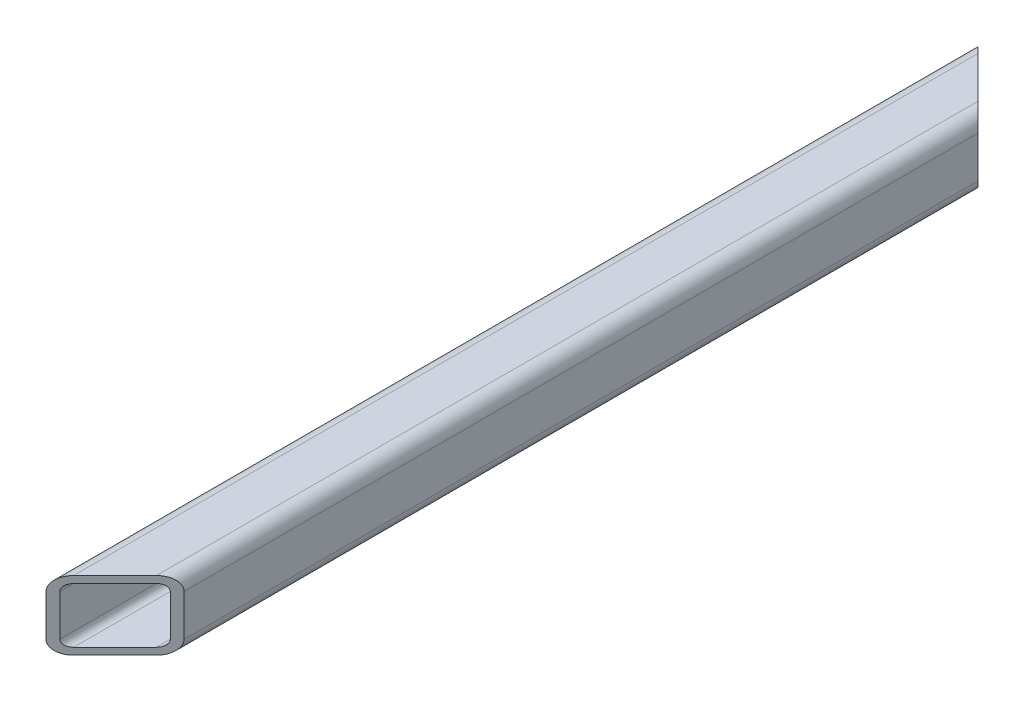
ISO-10303-21;
HEADER;
FILE_DESCRIPTION(('STEP AP214'),'2;1');
FILE_NAME('part.step','',(''),(''),'','','');
FILE_SCHEMA(('AUTOMOTIVE_DESIGN { 1 0 10303 214 1 1 1 1 }'));
ENDSEC;
DATA;
#1=APPLICATION_CONTEXT('core data for automotive mechanical design processes');
#2=APPLICATION_PROTOCOL_DEFINITION('international standard','automotive_design',2000,#1);
#3=PRODUCT_CONTEXT('',#1,'mechanical');
#4=PRODUCT('Part','Part','',(#3));
#5=PRODUCT_RELATED_PRODUCT_CATEGORY('part','',(#4));
#6=PRODUCT_DEFINITION_FORMATION('','',#4);
#7=PRODUCT_DEFINITION_CONTEXT('part definition',#1,'design');
#8=PRODUCT_DEFINITION('design','',#6,#7);
#9=PRODUCT_DEFINITION_SHAPE('','',#8);
#10=(LENGTH_UNIT() NAMED_UNIT(*) SI_UNIT(.MILLI.,.METRE.));
#11=(NAMED_UNIT(*) PLANE_ANGLE_UNIT() SI_UNIT($,.RADIAN.));
#12=(NAMED_UNIT(*) SI_UNIT($,.STERADIAN.) SOLID_ANGLE_UNIT());
#13=UNCERTAINTY_MEASURE_WITH_UNIT(LENGTH_MEASURE(1.E-05),#10,'distance_accuracy_value','');
#14=(GEOMETRIC_REPRESENTATION_CONTEXT(3) GLOBAL_UNCERTAINTY_ASSIGNED_CONTEXT((#13)) GLOBAL_UNIT_ASSIGNED_CONTEXT((#10,
#11,#12)) REPRESENTATION_CONTEXT('',''));
#15=CARTESIAN_POINT('',(0.,0.,0.));
#16=DIRECTION('',(0.,0.,1.));
#17=DIRECTION('',(1.,0.,0.));
#18=AXIS2_PLACEMENT_3D('',#15,#16,#17);
#19=CARTESIAN_POINT('',(-231.,206.,-450.));
#20=DIRECTION('',(0.,0.,1.));
#21=DIRECTION('',(1.,0.,0.));
#22=AXIS2_PLACEMENT_3D('',#19,#20,#21);
#23=CYLINDRICAL_SURFACE('',#22,4.);
#24=CARTESIAN_POINT('',(-231.,206.,-456.));
#25=DIRECTION('',(0.707106781186548,0.,-0.707106781186548));
#26=DIRECTION('',(0.707106781186548,0.,0.707106781186548));
#27=AXIS2_PLACEMENT_3D('',#24,#25,#26);
#28=ELLIPSE('',#27,5.65685424949238,4.);
#29=CARTESIAN_POINT('',(-235.,206.,-460.));
#30=VERTEX_POINT('',#29);
#31=CARTESIAN_POINT('',(-231.,210.,-456.));
#32=VERTEX_POINT('',#31);
#33=EDGE_CURVE('E169',#30,#32,#28,.T.);
#34=ORIENTED_EDGE('',*,*,#33,.F.);
#35=DIRECTION('',(0.,0.,1.));
#36=VECTOR('',#35,1.);
#37=CARTESIAN_POINT('',(-235.,206.,-450.));
#38=LINE('',#37,#36);
#39=CARTESIAN_POINT('',(-235.,206.,-190.));
#40=VERTEX_POINT('',#39);
#41=EDGE_CURVE('E45',#30,#40,#38,.T.);
#42=ORIENTED_EDGE('',*,*,#41,.T.);
#43=CARTESIAN_POINT('',(-231.,206.,-194.));
#44=DIRECTION('',(0.707106781186548,0.,0.707106781186548));
#45=DIRECTION('',(-0.707106781186548,0.,0.707106781186548));
#46=AXIS2_PLACEMENT_3D('',#43,#44,#45);
#47=ELLIPSE('',#46,5.65685424949239,4.);
#48=CARTESIAN_POINT('',(-231.,210.,-194.));
#49=VERTEX_POINT('',#48);
#50=EDGE_CURVE('E250',#49,#40,#47,.T.);
#51=ORIENTED_EDGE('',*,*,#50,.F.);
#52=DIRECTION('',(0.,0.,1.));
#53=VECTOR('',#52,1.);
#54=CARTESIAN_POINT('',(-231.,210.,-450.));
#55=LINE('',#54,#53);
#56=EDGE_CURVE('E243',#32,#49,#55,.T.);
#57=ORIENTED_EDGE('',*,*,#56,.F.);
#58=EDGE_LOOP('',(#34,#42,#51,#57));
#59=FACE_BOUND('',#58,.T.);
#60=ADVANCED_FACE('F41',(#59),#23,.T.);
#61=CARTESIAN_POINT('',(-231.,210.,-450.));
#62=DIRECTION('',(0.,-1.,0.));
#63=DIRECTION('',(0.,0.,-1.));
#64=AXIS2_PLACEMENT_3D('',#61,#62,#63);
#65=PLANE('',#64);
#66=DIRECTION('',(0.707106781186548,0.,0.707106781186548));
#67=VECTOR('',#66,1.);
#68=CARTESIAN_POINT('',(-228.,210.,-453.));
#69=LINE('',#68,#67);
#70=CARTESIAN_POINT('',(-219.,210.,-444.));
#71=VERTEX_POINT('',#70);
#72=EDGE_CURVE('E187',#32,#71,#69,.T.);
#73=ORIENTED_EDGE('',*,*,#72,.F.);
#74=ORIENTED_EDGE('',*,*,#56,.T.);
#75=DIRECTION('',(-0.707106781186548,0.,0.707106781186548));
#76=VECTOR('',#75,1.);
#77=CARTESIAN_POINT('',(-103.,210.,-322.));
#78=LINE('',#77,#76);
#79=CARTESIAN_POINT('',(-219.,210.,-206.));
#80=VERTEX_POINT('',#79);
#81=EDGE_CURVE('E159',#80,#49,#78,.T.);
#82=ORIENTED_EDGE('',*,*,#81,.F.);
#83=DIRECTION('',(0.,0.,1.));
#84=VECTOR('',#83,1.);
#85=CARTESIAN_POINT('',(-219.,210.,-450.));
#86=LINE('',#85,#84);
#87=EDGE_CURVE('E242',#71,#80,#86,.T.);
#88=ORIENTED_EDGE('',*,*,#87,.F.);
#89=EDGE_LOOP('',(#73,#74,#82,#88));
#90=FACE_BOUND('',#89,.T.);
#91=ADVANCED_FACE('F297',(#90),#65,.F.);
#92=CARTESIAN_POINT('',(-219.,206.,-450.));
#93=DIRECTION('',(0.,0.,1.));
#94=DIRECTION('',(1.,0.,0.));
#95=AXIS2_PLACEMENT_3D('',#92,#93,#94);
#96=CYLINDRICAL_SURFACE('',#95,4.);
#97=CARTESIAN_POINT('',(-219.,206.,-444.));
#98=DIRECTION('',(0.707106781186548,0.,-0.707106781186548));
#99=DIRECTION('',(0.707106781186548,0.,0.707106781186548));
#100=AXIS2_PLACEMENT_3D('',#97,#98,#99);
#101=ELLIPSE('',#100,5.65685424949238,4.);
#102=CARTESIAN_POINT('',(-215.,206.,-440.));
#103=VERTEX_POINT('',#102);
#104=EDGE_CURVE('E184',#71,#103,#101,.T.);
#105=ORIENTED_EDGE('',*,*,#104,.F.);
#106=ORIENTED_EDGE('',*,*,#87,.T.);
#107=CARTESIAN_POINT('',(-219.,206.,-206.));
#108=DIRECTION('',(0.707106781186548,0.,0.707106781186548));
#109=DIRECTION('',(-0.707106781186548,0.,0.707106781186548));
#110=AXIS2_PLACEMENT_3D('',#107,#108,#109);
#111=ELLIPSE('',#110,5.65685424949239,4.);
#112=CARTESIAN_POINT('',(-215.,206.,-210.));
#113=VERTEX_POINT('',#112);
#114=EDGE_CURVE('E170',#113,#80,#111,.T.);
#115=ORIENTED_EDGE('',*,*,#114,.F.);
#116=DIRECTION('',(0.,0.,1.));
#117=VECTOR('',#116,1.);
#118=CARTESIAN_POINT('',(-215.,206.,-450.));
#119=LINE('',#118,#117);
#120=EDGE_CURVE('E240',#103,#113,#119,.T.);
#121=ORIENTED_EDGE('',*,*,#120,.F.);
#122=EDGE_LOOP('',(#105,#106,#115,#121));
#123=FACE_BOUND('',#122,.T.);
#124=ADVANCED_FACE('F295',(#123),#96,.T.);
#125=CARTESIAN_POINT('',(-215.,194.,-450.));
#126=DIRECTION('',(-1.,0.,0.));
#127=DIRECTION('',(0.,0.,1.));
#128=AXIS2_PLACEMENT_3D('',#125,#126,#127);
#129=PLANE('',#128);
#130=DIRECTION('',(0.,-1.,0.));
#131=VECTOR('',#130,1.);
#132=CARTESIAN_POINT('',(-215.,194.,-440.));
#133=LINE('',#132,#131);
#134=CARTESIAN_POINT('',(-215.,194.,-440.));
#135=VERTEX_POINT('',#134);
#136=EDGE_CURVE('E179',#103,#135,#133,.T.);
#137=ORIENTED_EDGE('',*,*,#136,.F.);
#138=ORIENTED_EDGE('',*,*,#120,.T.);
#139=DIRECTION('',(0.,1.,0.));
#140=VECTOR('',#139,1.);
#141=CARTESIAN_POINT('',(-215.,194.,-210.));
#142=LINE('',#141,#140);
#143=CARTESIAN_POINT('',(-215.,194.,-210.));
#144=VERTEX_POINT('',#143);
#145=EDGE_CURVE('E289',#144,#113,#142,.T.);
#146=ORIENTED_EDGE('',*,*,#145,.F.);
#147=DIRECTION('',(0.,0.,1.));
#148=VECTOR('',#147,1.);
#149=CARTESIAN_POINT('',(-215.,194.,-450.));
#150=LINE('',#149,#148);
#151=EDGE_CURVE('E238',#135,#144,#150,.T.);
#152=ORIENTED_EDGE('',*,*,#151,.F.);
#153=EDGE_LOOP('',(#137,#138,#146,#152));
#154=FACE_BOUND('',#153,.T.);
#155=ADVANCED_FACE('F304',(#154),#129,.F.);
#156=CARTESIAN_POINT('',(-219.,194.,-450.));
#157=DIRECTION('',(0.,0.,1.));
#158=DIRECTION('',(1.,0.,0.));
#159=AXIS2_PLACEMENT_3D('',#156,#157,#158);
#160=CYLINDRICAL_SURFACE('',#159,4.);
#161=CARTESIAN_POINT('',(-219.,194.,-444.));
#162=DIRECTION('',(0.707106781186548,0.,-0.707106781186548));
#163=DIRECTION('',(0.707106781186548,0.,0.707106781186548));
#164=AXIS2_PLACEMENT_3D('',#161,#162,#163);
#165=ELLIPSE('',#164,5.65685424949238,4.);
#166=CARTESIAN_POINT('',(-219.,190.,-444.));
#167=VERTEX_POINT('',#166);
#168=EDGE_CURVE('E175',#135,#167,#165,.T.);
#169=ORIENTED_EDGE('',*,*,#168,.F.);
#170=ORIENTED_EDGE('',*,*,#151,.T.);
#171=CARTESIAN_POINT('',(-219.,194.,-206.));
#172=DIRECTION('',(0.707106781186548,0.,0.707106781186548));
#173=DIRECTION('',(-0.707106781186548,0.,0.707106781186548));
#174=AXIS2_PLACEMENT_3D('',#171,#172,#173);
#175=ELLIPSE('',#174,5.65685424949239,4.);
#176=CARTESIAN_POINT('',(-219.,190.,-206.));
#177=VERTEX_POINT('',#176);
#178=EDGE_CURVE('E286',#177,#144,#175,.T.);
#179=ORIENTED_EDGE('',*,*,#178,.F.);
#180=DIRECTION('',(0.,0.,1.));
#181=VECTOR('',#180,1.);
#182=CARTESIAN_POINT('',(-219.,190.,-450.));
#183=LINE('',#182,#181);
#184=EDGE_CURVE('E236',#167,#177,#183,.T.);
#185=ORIENTED_EDGE('',*,*,#184,.F.);
#186=EDGE_LOOP('',(#169,#170,#179,#185));
#187=FACE_BOUND('',#186,.T.);
#188=ADVANCED_FACE('F309',(#187),#160,.T.);
#189=CARTESIAN_POINT('',(-219.,190.,-450.));
#190=DIRECTION('',(0.,1.,0.));
#191=DIRECTION('',(0.,0.,1.));
#192=AXIS2_PLACEMENT_3D('',#189,#190,#191);
#193=PLANE('',#192);
#194=DIRECTION('',(-0.707106781186548,0.,-0.707106781186548));
#195=VECTOR('',#194,1.);
#196=CARTESIAN_POINT('',(-222.,190.,-447.));
#197=LINE('',#196,#195);
#198=CARTESIAN_POINT('',(-231.,190.,-456.));
#199=VERTEX_POINT('',#198);
#200=EDGE_CURVE('E51',#167,#199,#197,.T.);
#201=ORIENTED_EDGE('',*,*,#200,.F.);
#202=ORIENTED_EDGE('',*,*,#184,.T.);
#203=DIRECTION('',(0.707106781186548,0.,-0.707106781186548));
#204=VECTOR('',#203,1.);
#205=CARTESIAN_POINT('',(-96.9999999999999,190.,-328.));
#206=LINE('',#205,#204);
#207=CARTESIAN_POINT('',(-231.,190.,-194.));
#208=VERTEX_POINT('',#207);
#209=EDGE_CURVE('E283',#208,#177,#206,.T.);
#210=ORIENTED_EDGE('',*,*,#209,.F.);
#211=DIRECTION('',(0.,0.,1.));
#212=VECTOR('',#211,1.);
#213=CARTESIAN_POINT('',(-231.,190.,-450.));
#214=LINE('',#213,#212);
#215=EDGE_CURVE('E194',#199,#208,#214,.T.);
#216=ORIENTED_EDGE('',*,*,#215,.F.);
#217=EDGE_LOOP('',(#201,#202,#210,#216));
#218=FACE_BOUND('',#217,.T.);
#219=ADVANCED_FACE('F313',(#218),#193,.F.);
#220=CARTESIAN_POINT('',(-231.,194.,-450.));
#221=DIRECTION('',(0.,0.,1.));
#222=DIRECTION('',(1.,0.,0.));
#223=AXIS2_PLACEMENT_3D('',#220,#221,#222);
#224=CYLINDRICAL_SURFACE('',#223,4.);
#225=CARTESIAN_POINT('',(-231.,194.,-456.));
#226=DIRECTION('',(0.707106781186548,0.,-0.707106781186548));
#227=DIRECTION('',(0.707106781186548,0.,0.707106781186548));
#228=AXIS2_PLACEMENT_3D('',#225,#226,#227);
#229=ELLIPSE('',#228,5.65685424949238,4.);
#230=CARTESIAN_POINT('',(-235.,194.,-460.));
#231=VERTEX_POINT('',#230);
#232=EDGE_CURVE('E11',#199,#231,#229,.T.);
#233=ORIENTED_EDGE('',*,*,#232,.F.);
#234=ORIENTED_EDGE('',*,*,#215,.T.);
#235=CARTESIAN_POINT('',(-231.,194.,-194.));
#236=DIRECTION('',(0.707106781186548,0.,0.707106781186548));
#237=DIRECTION('',(-0.707106781186548,0.,0.707106781186548));
#238=AXIS2_PLACEMENT_3D('',#235,#236,#237);
#239=ELLIPSE('',#238,5.65685424949239,4.);
#240=CARTESIAN_POINT('',(-235.,194.,-190.));
#241=VERTEX_POINT('',#240);
#242=EDGE_CURVE('E155',#241,#208,#239,.T.);
#243=ORIENTED_EDGE('',*,*,#242,.F.);
#244=DIRECTION('',(0.,0.,1.));
#245=VECTOR('',#244,1.);
#246=CARTESIAN_POINT('',(-235.,194.,-450.));
#247=LINE('',#246,#245);
#248=EDGE_CURVE('E150',#231,#241,#247,.T.);
#249=ORIENTED_EDGE('',*,*,#248,.F.);
#250=EDGE_LOOP('',(#233,#234,#243,#249));
#251=FACE_BOUND('',#250,.T.);
#252=ADVANCED_FACE('F152',(#251),#224,.T.);
#253=CARTESIAN_POINT('',(-219.,206.,-450.));
#254=DIRECTION('',(0.,0.,1.));
#255=DIRECTION('',(1.,0.,0.));
#256=AXIS2_PLACEMENT_3D('',#253,#254,#255);
#257=CYLINDRICAL_SURFACE('',#256,2.);
#258=DIRECTION('',(0.,0.,1.));
#259=VECTOR('',#258,1.);
#260=CARTESIAN_POINT('',(-219.,208.,-450.));
#261=LINE('',#260,#259);
#262=CARTESIAN_POINT('',(-219.,208.,-444.));
#263=VERTEX_POINT('',#262);
#264=CARTESIAN_POINT('',(-219.,208.,-206.));
#265=VERTEX_POINT('',#264);
#266=EDGE_CURVE('E198',#263,#265,#261,.T.);
#267=ORIENTED_EDGE('',*,*,#266,.F.);
#268=CARTESIAN_POINT('',(-219.,206.,-444.));
#269=DIRECTION('',(0.707106781186548,0.,-0.707106781186548));
#270=DIRECTION('',(0.707106781186548,0.,0.707106781186548));
#271=AXIS2_PLACEMENT_3D('',#268,#269,#270);
#272=ELLIPSE('',#271,2.82842712474619,2.);
#273=CARTESIAN_POINT('',(-217.,206.,-442.));
#274=VERTEX_POINT('',#273);
#275=EDGE_CURVE('E191',#263,#274,#272,.T.);
#276=ORIENTED_EDGE('',*,*,#275,.T.);
#277=DIRECTION('',(0.,0.,1.));
#278=VECTOR('',#277,1.);
#279=CARTESIAN_POINT('',(-217.,206.,-450.));
#280=LINE('',#279,#278);
#281=CARTESIAN_POINT('',(-217.,206.,-208.));
#282=VERTEX_POINT('',#281);
#283=EDGE_CURVE('E193',#274,#282,#280,.T.);
#284=ORIENTED_EDGE('',*,*,#283,.T.);
#285=CARTESIAN_POINT('',(-219.,206.,-206.));
#286=DIRECTION('',(0.707106781186548,0.,0.707106781186548));
#287=DIRECTION('',(-0.707106781186548,0.,0.707106781186548));
#288=AXIS2_PLACEMENT_3D('',#285,#286,#287);
#289=ELLIPSE('',#288,2.82842712474619,2.);
#290=EDGE_CURVE('E199',#282,#265,#289,.T.);
#291=ORIENTED_EDGE('',*,*,#290,.T.);
#292=EDGE_LOOP('',(#267,#276,#284,#291));
#293=FACE_BOUND('',#292,.T.);
#294=ADVANCED_FACE('F319',(#293),#257,.F.);
#295=CARTESIAN_POINT('',(-231.,208.,-450.));
#296=DIRECTION('',(0.,-1.,0.));
#297=DIRECTION('',(0.,0.,-1.));
#298=AXIS2_PLACEMENT_3D('',#295,#296,#297);
#299=PLANE('',#298);
#300=DIRECTION('',(0.,0.,1.));
#301=VECTOR('',#300,1.);
#302=CARTESIAN_POINT('',(-231.,208.,-450.));
#303=LINE('',#302,#301);
#304=CARTESIAN_POINT('',(-231.,208.,-456.));
#305=VERTEX_POINT('',#304);
#306=CARTESIAN_POINT('',(-231.,208.,-194.));
#307=VERTEX_POINT('',#306);
#308=EDGE_CURVE('E203',#305,#307,#303,.T.);
#309=ORIENTED_EDGE('',*,*,#308,.F.);
#310=DIRECTION('',(0.707106781186548,0.,0.707106781186548));
#311=VECTOR('',#310,1.);
#312=CARTESIAN_POINT('',(-228.,208.,-453.));
#313=LINE('',#312,#311);
#314=EDGE_CURVE('E195',#305,#263,#313,.T.);
#315=ORIENTED_EDGE('',*,*,#314,.T.);
#316=ORIENTED_EDGE('',*,*,#266,.T.);
#317=DIRECTION('',(-0.707106781186548,0.,0.707106781186548));
#318=VECTOR('',#317,1.);
#319=CARTESIAN_POINT('',(-103.,208.,-322.));
#320=LINE('',#319,#318);
#321=EDGE_CURVE('E204',#265,#307,#320,.T.);
#322=ORIENTED_EDGE('',*,*,#321,.T.);
#323=EDGE_LOOP('',(#309,#315,#316,#322));
#324=FACE_BOUND('',#323,.T.);
#325=ADVANCED_FACE('F325',(#324),#299,.T.);
#326=CARTESIAN_POINT('',(-231.,206.,-450.));
#327=DIRECTION('',(0.,0.,1.));
#328=DIRECTION('',(1.,0.,0.));
#329=AXIS2_PLACEMENT_3D('',#326,#327,#328);
#330=CYLINDRICAL_SURFACE('',#329,2.);
#331=DIRECTION('',(0.,0.,1.));
#332=VECTOR('',#331,1.);
#333=CARTESIAN_POINT('',(-233.,206.,-450.));
#334=LINE('',#333,#332);
#335=CARTESIAN_POINT('',(-233.,206.,-458.));
#336=VERTEX_POINT('',#335);
#337=CARTESIAN_POINT('',(-233.,206.,-192.));
#338=VERTEX_POINT('',#337);
#339=EDGE_CURVE('E208',#336,#338,#334,.T.);
#340=ORIENTED_EDGE('',*,*,#339,.F.);
#341=CARTESIAN_POINT('',(-231.,206.,-456.));
#342=DIRECTION('',(0.707106781186548,0.,-0.707106781186548));
#343=DIRECTION('',(0.707106781186548,0.,0.707106781186548));
#344=AXIS2_PLACEMENT_3D('',#341,#342,#343);
#345=ELLIPSE('',#344,2.82842712474619,2.);
#346=EDGE_CURVE('E200',#336,#305,#345,.T.);
#347=ORIENTED_EDGE('',*,*,#346,.T.);
#348=ORIENTED_EDGE('',*,*,#308,.T.);
#349=CARTESIAN_POINT('',(-231.,206.,-194.));
#350=DIRECTION('',(0.707106781186548,0.,0.707106781186548));
#351=DIRECTION('',(-0.707106781186548,0.,0.707106781186548));
#352=AXIS2_PLACEMENT_3D('',#349,#350,#351);
#353=ELLIPSE('',#352,2.82842712474619,2.);
#354=EDGE_CURVE('E209',#307,#338,#353,.T.);
#355=ORIENTED_EDGE('',*,*,#354,.T.);
#356=EDGE_LOOP('',(#340,#347,#348,#355));
#357=FACE_BOUND('',#356,.T.);
#358=ADVANCED_FACE('F329',(#357),#330,.F.);
#359=CARTESIAN_POINT('',(-233.,206.,-450.));
#360=DIRECTION('',(1.,0.,0.));
#361=DIRECTION('',(0.,0.,-1.));
#362=AXIS2_PLACEMENT_3D('',#359,#360,#361);
#363=PLANE('',#362);
#364=DIRECTION('',(0.,0.,1.));
#365=VECTOR('',#364,1.);
#366=CARTESIAN_POINT('',(-233.,194.,-450.));
#367=LINE('',#366,#365);
#368=CARTESIAN_POINT('',(-233.,194.,-458.));
#369=VERTEX_POINT('',#368);
#370=CARTESIAN_POINT('',(-233.,194.,-192.));
#371=VERTEX_POINT('',#370);
#372=EDGE_CURVE('E213',#369,#371,#367,.T.);
#373=ORIENTED_EDGE('',*,*,#372,.F.);
#374=DIRECTION('',(0.,1.,0.));
#375=VECTOR('',#374,1.);
#376=CARTESIAN_POINT('',(-233.,206.,-458.));
#377=LINE('',#376,#375);
#378=EDGE_CURVE('E205',#369,#336,#377,.T.);
#379=ORIENTED_EDGE('',*,*,#378,.T.);
#380=ORIENTED_EDGE('',*,*,#339,.T.);
#381=DIRECTION('',(0.,-1.,0.));
#382=VECTOR('',#381,1.);
#383=CARTESIAN_POINT('',(-233.,206.,-192.));
#384=LINE('',#383,#382);
#385=EDGE_CURVE('E214',#338,#371,#384,.T.);
#386=ORIENTED_EDGE('',*,*,#385,.T.);
#387=EDGE_LOOP('',(#373,#379,#380,#386));
#388=FACE_BOUND('',#387,.T.);
#389=ADVANCED_FACE('F333',(#388),#363,.T.);
#390=CARTESIAN_POINT('',(-231.,194.,-450.));
#391=DIRECTION('',(0.,0.,1.));
#392=DIRECTION('',(1.,0.,0.));
#393=AXIS2_PLACEMENT_3D('',#390,#391,#392);
#394=CYLINDRICAL_SURFACE('',#393,2.);
#395=DIRECTION('',(0.,0.,1.));
#396=VECTOR('',#395,1.);
#397=CARTESIAN_POINT('',(-231.,192.,-450.));
#398=LINE('',#397,#396);
#399=CARTESIAN_POINT('',(-231.,192.,-456.));
#400=VERTEX_POINT('',#399);
#401=CARTESIAN_POINT('',(-231.,192.,-194.));
#402=VERTEX_POINT('',#401);
#403=EDGE_CURVE('E218',#400,#402,#398,.T.);
#404=ORIENTED_EDGE('',*,*,#403,.F.);
#405=CARTESIAN_POINT('',(-231.,194.,-456.));
#406=DIRECTION('',(0.707106781186548,0.,-0.707106781186548));
#407=DIRECTION('',(0.707106781186548,0.,0.707106781186548));
#408=AXIS2_PLACEMENT_3D('',#405,#406,#407);
#409=ELLIPSE('',#408,2.82842712474619,2.);
#410=EDGE_CURVE('E210',#400,#369,#409,.T.);
#411=ORIENTED_EDGE('',*,*,#410,.T.);
#412=ORIENTED_EDGE('',*,*,#372,.T.);
#413=CARTESIAN_POINT('',(-231.,194.,-194.));
#414=DIRECTION('',(0.707106781186548,0.,0.707106781186548));
#415=DIRECTION('',(-0.707106781186548,0.,0.707106781186548));
#416=AXIS2_PLACEMENT_3D('',#413,#414,#415);
#417=ELLIPSE('',#416,2.82842712474619,2.);
#418=EDGE_CURVE('E219',#371,#402,#417,.T.);
#419=ORIENTED_EDGE('',*,*,#418,.T.);
#420=EDGE_LOOP('',(#404,#411,#412,#419));
#421=FACE_BOUND('',#420,.T.);
#422=ADVANCED_FACE('F337',(#421),#394,.F.);
#423=CARTESIAN_POINT('',(-219.,192.,-450.));
#424=DIRECTION('',(0.,1.,0.));
#425=DIRECTION('',(0.,0.,1.));
#426=AXIS2_PLACEMENT_3D('',#423,#424,#425);
#427=PLANE('',#426);
#428=DIRECTION('',(0.,0.,1.));
#429=VECTOR('',#428,1.);
#430=CARTESIAN_POINT('',(-219.,192.,-450.));
#431=LINE('',#430,#429);
#432=CARTESIAN_POINT('',(-219.,192.,-444.));
#433=VERTEX_POINT('',#432);
#434=CARTESIAN_POINT('',(-219.,192.,-206.));
#435=VERTEX_POINT('',#434);
#436=EDGE_CURVE('E222',#433,#435,#431,.T.);
#437=ORIENTED_EDGE('',*,*,#436,.F.);
#438=DIRECTION('',(-0.707106781186548,0.,-0.707106781186548));
#439=VECTOR('',#438,1.);
#440=CARTESIAN_POINT('',(-222.,192.,-447.));
#441=LINE('',#440,#439);
#442=EDGE_CURVE('E215',#433,#400,#441,.T.);
#443=ORIENTED_EDGE('',*,*,#442,.T.);
#444=ORIENTED_EDGE('',*,*,#403,.T.);
#445=DIRECTION('',(0.707106781186548,0.,-0.707106781186548));
#446=VECTOR('',#445,1.);
#447=CARTESIAN_POINT('',(-96.9999999999999,192.,-328.));
#448=LINE('',#447,#446);
#449=EDGE_CURVE('E223',#402,#435,#448,.T.);
#450=ORIENTED_EDGE('',*,*,#449,.T.);
#451=EDGE_LOOP('',(#437,#443,#444,#450));
#452=FACE_BOUND('',#451,.T.);
#453=ADVANCED_FACE('F341',(#452),#427,.T.);
#454=CARTESIAN_POINT('',(-219.,194.,-450.));
#455=DIRECTION('',(0.,0.,1.));
#456=DIRECTION('',(1.,0.,0.));
#457=AXIS2_PLACEMENT_3D('',#454,#455,#456);
#458=CYLINDRICAL_SURFACE('',#457,2.);
#459=DIRECTION('',(0.,0.,1.));
#460=VECTOR('',#459,1.);
#461=CARTESIAN_POINT('',(-217.,194.,-450.));
#462=LINE('',#461,#460);
#463=CARTESIAN_POINT('',(-217.,194.,-442.));
#464=VERTEX_POINT('',#463);
#465=CARTESIAN_POINT('',(-217.,194.,-208.));
#466=VERTEX_POINT('',#465);
#467=EDGE_CURVE('E225',#464,#466,#462,.T.);
#468=ORIENTED_EDGE('',*,*,#467,.F.);
#469=CARTESIAN_POINT('',(-219.,194.,-444.));
#470=DIRECTION('',(0.707106781186548,0.,-0.707106781186548));
#471=DIRECTION('',(0.707106781186548,0.,0.707106781186548));
#472=AXIS2_PLACEMENT_3D('',#469,#470,#471);
#473=ELLIPSE('',#472,2.82842712474619,2.);
#474=EDGE_CURVE('E220',#464,#433,#473,.T.);
#475=ORIENTED_EDGE('',*,*,#474,.T.);
#476=ORIENTED_EDGE('',*,*,#436,.T.);
#477=CARTESIAN_POINT('',(-219.,194.,-206.));
#478=DIRECTION('',(0.707106781186548,0.,0.707106781186548));
#479=DIRECTION('',(-0.707106781186548,0.,0.707106781186548));
#480=AXIS2_PLACEMENT_3D('',#477,#478,#479);
#481=ELLIPSE('',#480,2.82842712474619,2.);
#482=EDGE_CURVE('E228',#435,#466,#481,.T.);
#483=ORIENTED_EDGE('',*,*,#482,.T.);
#484=EDGE_LOOP('',(#468,#475,#476,#483));
#485=FACE_BOUND('',#484,.T.);
#486=ADVANCED_FACE('F345',(#485),#458,.F.);
#487=CARTESIAN_POINT('',(-217.,194.,-450.));
#488=DIRECTION('',(-1.,0.,0.));
#489=DIRECTION('',(0.,0.,1.));
#490=AXIS2_PLACEMENT_3D('',#487,#488,#489);
#491=PLANE('',#490);
#492=ORIENTED_EDGE('',*,*,#283,.F.);
#493=DIRECTION('',(0.,-1.,0.));
#494=VECTOR('',#493,1.);
#495=CARTESIAN_POINT('',(-217.,194.,-442.));
#496=LINE('',#495,#494);
#497=EDGE_CURVE('E59',#274,#464,#496,.T.);
#498=ORIENTED_EDGE('',*,*,#497,.T.);
#499=ORIENTED_EDGE('',*,*,#467,.T.);
#500=DIRECTION('',(0.,1.,0.));
#501=VECTOR('',#500,1.);
#502=CARTESIAN_POINT('',(-217.,194.,-208.));
#503=LINE('',#502,#501);
#504=EDGE_CURVE('E160',#466,#282,#503,.T.);
#505=ORIENTED_EDGE('',*,*,#504,.T.);
#506=EDGE_LOOP('',(#492,#498,#499,#505));
#507=FACE_BOUND('',#506,.T.);
#508=ADVANCED_FACE('F322',(#507),#491,.T.);
#509=CARTESIAN_POINT('',(-235.,206.,-450.));
#510=DIRECTION('',(1.,0.,0.));
#511=DIRECTION('',(0.,0.,-1.));
#512=AXIS2_PLACEMENT_3D('',#509,#510,#511);
#513=PLANE('',#512);
#514=DIRECTION('',(0.,1.,0.));
#515=VECTOR('',#514,1.);
#516=CARTESIAN_POINT('',(-235.,206.,-460.));
#517=LINE('',#516,#515);
#518=EDGE_CURVE('E164',#231,#30,#517,.T.);
#519=ORIENTED_EDGE('',*,*,#518,.F.);
#520=ORIENTED_EDGE('',*,*,#248,.T.);
#521=DIRECTION('',(0.,-1.,0.));
#522=VECTOR('',#521,1.);
#523=CARTESIAN_POINT('',(-235.,206.,-190.));
#524=LINE('',#523,#522);
#525=EDGE_CURVE('E252',#40,#241,#524,.T.);
#526=ORIENTED_EDGE('',*,*,#525,.F.);
#527=ORIENTED_EDGE('',*,*,#41,.F.);
#528=EDGE_LOOP('',(#519,#520,#526,#527));
#529=FACE_BOUND('',#528,.T.);
#530=ADVANCED_FACE('F165',(#529),#513,.F.);
#531=CARTESIAN_POINT('',(-225.,200.,-200.));
#532=DIRECTION('',(0.707106781186548,0.,0.707106781186548));
#533=DIRECTION('',(0.707106781186548,0.,-0.707106781186548));
#534=AXIS2_PLACEMENT_3D('',#531,#532,#533);
#535=PLANE('',#534);
#536=ORIENTED_EDGE('',*,*,#290,.F.);
#537=ORIENTED_EDGE('',*,*,#504,.F.);
#538=ORIENTED_EDGE('',*,*,#482,.F.);
#539=ORIENTED_EDGE('',*,*,#449,.F.);
#540=ORIENTED_EDGE('',*,*,#418,.F.);
#541=ORIENTED_EDGE('',*,*,#385,.F.);
#542=ORIENTED_EDGE('',*,*,#354,.F.);
#543=ORIENTED_EDGE('',*,*,#321,.F.);
#544=EDGE_LOOP('',(#536,#537,#538,#539,#540,#541,#542,#543));
#545=FACE_BOUND('',#544,.T.);
#546=ORIENTED_EDGE('',*,*,#81,.T.);
#547=ORIENTED_EDGE('',*,*,#50,.T.);
#548=ORIENTED_EDGE('',*,*,#525,.T.);
#549=ORIENTED_EDGE('',*,*,#242,.T.);
#550=ORIENTED_EDGE('',*,*,#209,.T.);
#551=ORIENTED_EDGE('',*,*,#178,.T.);
#552=ORIENTED_EDGE('',*,*,#145,.T.);
#553=ORIENTED_EDGE('',*,*,#114,.T.);
#554=EDGE_LOOP('',(#546,#547,#548,#549,#550,#551,#552,#553));
#555=FACE_BOUND('',#554,.T.);
#556=ADVANCED_FACE('F255',(#545,#555),#535,.T.);
#557=CARTESIAN_POINT('',(-225.,200.,-450.));
#558=DIRECTION('',(0.707106781186548,0.,-0.707106781186548));
#559=DIRECTION('',(-0.707106781186548,0.,-0.707106781186548));
#560=AXIS2_PLACEMENT_3D('',#557,#558,#559);
#561=PLANE('',#560);
#562=ORIENTED_EDGE('',*,*,#275,.F.);
#563=ORIENTED_EDGE('',*,*,#314,.F.);
#564=ORIENTED_EDGE('',*,*,#346,.F.);
#565=ORIENTED_EDGE('',*,*,#378,.F.);
#566=ORIENTED_EDGE('',*,*,#410,.F.);
#567=ORIENTED_EDGE('',*,*,#442,.F.);
#568=ORIENTED_EDGE('',*,*,#474,.F.);
#569=ORIENTED_EDGE('',*,*,#497,.F.);
#570=EDGE_LOOP('',(#562,#563,#564,#565,#566,#567,#568,#569));
#571=FACE_BOUND('',#570,.T.);
#572=ORIENTED_EDGE('',*,*,#518,.T.);
#573=ORIENTED_EDGE('',*,*,#33,.T.);
#574=ORIENTED_EDGE('',*,*,#72,.T.);
#575=ORIENTED_EDGE('',*,*,#104,.T.);
#576=ORIENTED_EDGE('',*,*,#136,.T.);
#577=ORIENTED_EDGE('',*,*,#168,.T.);
#578=ORIENTED_EDGE('',*,*,#200,.T.);
#579=ORIENTED_EDGE('',*,*,#232,.T.);
#580=EDGE_LOOP('',(#572,#573,#574,#575,#576,#577,#578,#579));
#581=FACE_BOUND('',#580,.T.);
#582=ADVANCED_FACE('F43',(#571,#581),#561,.T.);
#583=CLOSED_SHELL('',(#60,#91,#124,#155,#188,#219,#252,#294,#325,#358,#389,#422,#453,#486,#508,
#530,#556,#582));
#584=MANIFOLD_SOLID_BREP('B2',#583);
#585=ADVANCED_BREP_SHAPE_REPRESENTATION('',(#18,#584),#14);
#586=SHAPE_DEFINITION_REPRESENTATION(#9,#585);
ENDSEC;
END-ISO-10303-21;
